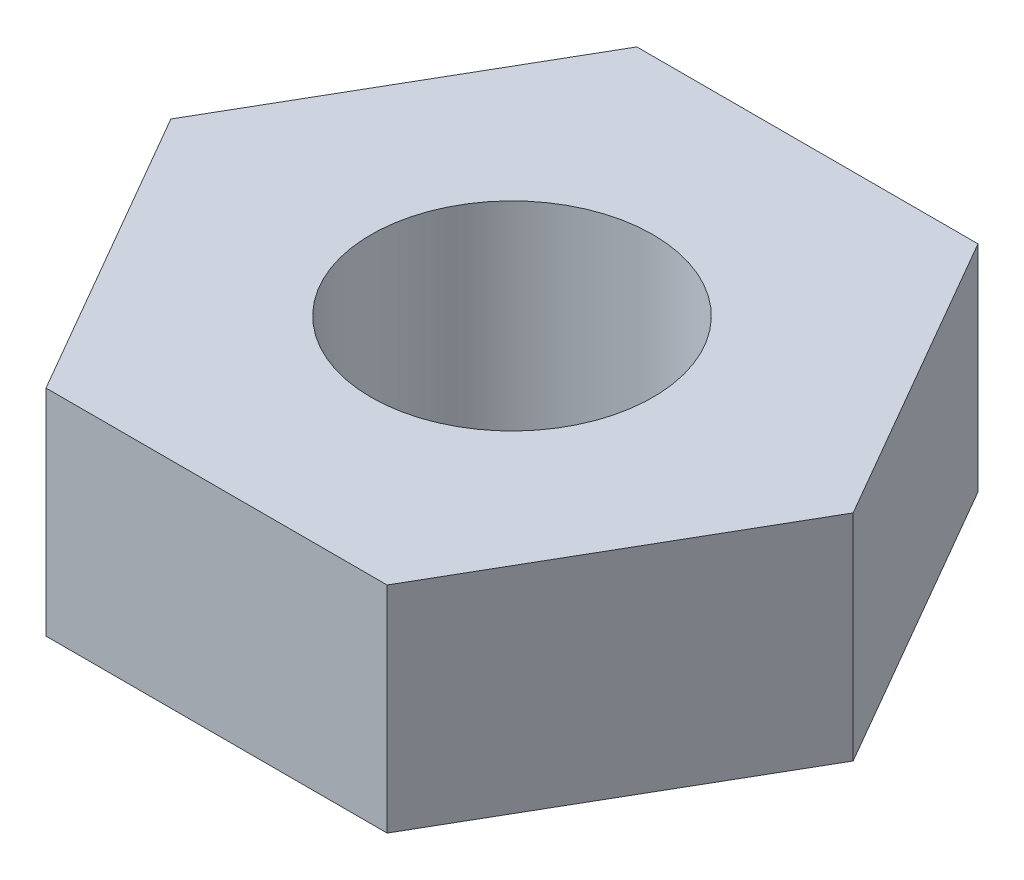
ISO-10303-21;
HEADER;
FILE_DESCRIPTION(('STEP AP214'),'2;1');
FILE_NAME('part.step','',(''),(''),'','','');
FILE_SCHEMA(('AUTOMOTIVE_DESIGN { 1 0 10303 214 1 1 1 1 }'));
ENDSEC;
DATA;
#1=APPLICATION_CONTEXT('core data for automotive mechanical design processes');
#2=APPLICATION_PROTOCOL_DEFINITION('international standard','automotive_design',2000,#1);
#3=PRODUCT_CONTEXT('',#1,'mechanical');
#4=PRODUCT('Part','Part','',(#3));
#5=PRODUCT_RELATED_PRODUCT_CATEGORY('part','',(#4));
#6=PRODUCT_DEFINITION_FORMATION('','',#4);
#7=PRODUCT_DEFINITION_CONTEXT('part definition',#1,'design');
#8=PRODUCT_DEFINITION('design','',#6,#7);
#9=PRODUCT_DEFINITION_SHAPE('','',#8);
#10=(LENGTH_UNIT() NAMED_UNIT(*) SI_UNIT(.MILLI.,.METRE.));
#11=(NAMED_UNIT(*) PLANE_ANGLE_UNIT() SI_UNIT($,.RADIAN.));
#12=(NAMED_UNIT(*) SI_UNIT($,.STERADIAN.) SOLID_ANGLE_UNIT());
#13=UNCERTAINTY_MEASURE_WITH_UNIT(LENGTH_MEASURE(1.E-05),#10,'distance_accuracy_value','');
#14=(GEOMETRIC_REPRESENTATION_CONTEXT(3) GLOBAL_UNCERTAINTY_ASSIGNED_CONTEXT((#13)) GLOBAL_UNIT_ASSIGNED_CONTEXT((#10,
#11,#12)) REPRESENTATION_CONTEXT('',''));
#15=CARTESIAN_POINT('',(0.,0.,0.));
#16=DIRECTION('',(0.,0.,1.));
#17=DIRECTION('',(1.,0.,0.));
#18=AXIS2_PLACEMENT_3D('',#15,#16,#17);
#19=CARTESIAN_POINT('',(5.04098953786192,3.175,0.));
#20=DIRECTION('',(-0.866025403784438,0.,0.5));
#21=DIRECTION('',(0.5,0.,0.866025403784438));
#22=AXIS2_PLACEMENT_3D('',#19,#20,#21);
#23=PLANE('',#22);
#24=DIRECTION('',(-0.5,0.,-0.866025403784438));
#25=VECTOR('',#24,1.);
#26=CARTESIAN_POINT('',(5.04098953786192,0.,0.));
#27=LINE('',#26,#25);
#28=CARTESIAN_POINT('',(5.04098953786192,0.,0.));
#29=VERTEX_POINT('',#28);
#30=CARTESIAN_POINT('',(2.52049476893096,0.,-4.365625));
#31=VERTEX_POINT('',#30);
#32=EDGE_CURVE('E122',#29,#31,#27,.T.);
#33=ORIENTED_EDGE('',*,*,#32,.T.);
#34=DIRECTION('',(0.,-1.,0.));
#35=VECTOR('',#34,1.);
#36=CARTESIAN_POINT('',(2.52049476893096,3.175,-4.365625));
#37=LINE('',#36,#35);
#38=CARTESIAN_POINT('',(2.52049476893096,3.175,-4.365625));
#39=VERTEX_POINT('',#38);
#40=EDGE_CURVE('E11',#39,#31,#37,.T.);
#41=ORIENTED_EDGE('',*,*,#40,.F.);
#42=DIRECTION('',(-0.5,0.,-0.866025403784438));
#43=VECTOR('',#42,1.);
#44=CARTESIAN_POINT('',(5.04098953786192,3.175,0.));
#45=LINE('',#44,#43);
#46=CARTESIAN_POINT('',(5.04098953786192,3.175,0.));
#47=VERTEX_POINT('',#46);
#48=EDGE_CURVE('E133',#47,#39,#45,.T.);
#49=ORIENTED_EDGE('',*,*,#48,.F.);
#50=DIRECTION('',(0.,-1.,0.));
#51=VECTOR('',#50,1.);
#52=CARTESIAN_POINT('',(5.04098953786192,3.175,0.));
#53=LINE('',#52,#51);
#54=EDGE_CURVE('E118',#47,#29,#53,.T.);
#55=ORIENTED_EDGE('',*,*,#54,.T.);
#56=EDGE_LOOP('',(#33,#41,#49,#55));
#57=FACE_BOUND('',#56,.T.);
#58=ADVANCED_FACE('F38',(#57),#23,.F.);
#59=CARTESIAN_POINT('',(2.52049476893096,3.175,-4.365625));
#60=DIRECTION('',(0.,0.,1.));
#61=DIRECTION('',(1.,0.,0.));
#62=AXIS2_PLACEMENT_3D('',#59,#60,#61);
#63=PLANE('',#62);
#64=DIRECTION('',(-1.,0.,0.));
#65=VECTOR('',#64,1.);
#66=CARTESIAN_POINT('',(2.52049476893096,0.,-4.365625));
#67=LINE('',#66,#65);
#68=CARTESIAN_POINT('',(-2.52049476893096,0.,-4.365625));
#69=VERTEX_POINT('',#68);
#70=EDGE_CURVE('E125',#31,#69,#67,.T.);
#71=ORIENTED_EDGE('',*,*,#70,.T.);
#72=DIRECTION('',(0.,-1.,0.));
#73=VECTOR('',#72,1.);
#74=CARTESIAN_POINT('',(-2.52049476893096,3.175,-4.365625));
#75=LINE('',#74,#73);
#76=CARTESIAN_POINT('',(-2.52049476893096,3.175,-4.365625));
#77=VERTEX_POINT('',#76);
#78=EDGE_CURVE('E46',#77,#69,#75,.T.);
#79=ORIENTED_EDGE('',*,*,#78,.F.);
#80=DIRECTION('',(-1.,0.,0.));
#81=VECTOR('',#80,1.);
#82=CARTESIAN_POINT('',(2.52049476893096,3.175,-4.365625));
#83=LINE('',#82,#81);
#84=EDGE_CURVE('E91',#39,#77,#83,.T.);
#85=ORIENTED_EDGE('',*,*,#84,.F.);
#86=ORIENTED_EDGE('',*,*,#40,.T.);
#87=EDGE_LOOP('',(#71,#79,#85,#86));
#88=FACE_BOUND('',#87,.T.);
#89=ADVANCED_FACE('F158',(#88),#63,.F.);
#90=CARTESIAN_POINT('',(-2.52049476893096,3.175,-4.365625));
#91=DIRECTION('',(0.866025403784439,0.,0.5));
#92=DIRECTION('',(0.5,0.,-0.866025403784439));
#93=AXIS2_PLACEMENT_3D('',#90,#91,#92);
#94=PLANE('',#93);
#95=DIRECTION('',(-0.5,0.,0.866025403784438));
#96=VECTOR('',#95,1.);
#97=CARTESIAN_POINT('',(-2.52049476893096,0.,-4.365625));
#98=LINE('',#97,#96);
#99=CARTESIAN_POINT('',(-5.04098953786192,0.,0.));
#100=VERTEX_POINT('',#99);
#101=EDGE_CURVE('E128',#69,#100,#98,.T.);
#102=ORIENTED_EDGE('',*,*,#101,.T.);
#103=DIRECTION('',(0.,-1.,0.));
#104=VECTOR('',#103,1.);
#105=CARTESIAN_POINT('',(-5.04098953786192,3.175,0.));
#106=LINE('',#105,#104);
#107=CARTESIAN_POINT('',(-5.04098953786192,3.175,0.));
#108=VERTEX_POINT('',#107);
#109=EDGE_CURVE('E113',#108,#100,#106,.T.);
#110=ORIENTED_EDGE('',*,*,#109,.F.);
#111=DIRECTION('',(-0.5,0.,0.866025403784438));
#112=VECTOR('',#111,1.);
#113=CARTESIAN_POINT('',(-2.52049476893096,3.175,-4.365625));
#114=LINE('',#113,#112);
#115=EDGE_CURVE('E104',#77,#108,#114,.T.);
#116=ORIENTED_EDGE('',*,*,#115,.F.);
#117=ORIENTED_EDGE('',*,*,#78,.T.);
#118=EDGE_LOOP('',(#102,#110,#116,#117));
#119=FACE_BOUND('',#118,.T.);
#120=ADVANCED_FACE('F139',(#119),#94,.F.);
#121=CARTESIAN_POINT('',(-5.04098953786192,3.175,0.));
#122=DIRECTION('',(0.866025403784439,0.,-0.5));
#123=DIRECTION('',(-0.5,0.,-0.866025403784439));
#124=AXIS2_PLACEMENT_3D('',#121,#122,#123);
#125=PLANE('',#124);
#126=DIRECTION('',(0.5,0.,0.866025403784439));
#127=VECTOR('',#126,1.);
#128=CARTESIAN_POINT('',(-5.04098953786192,0.,0.));
#129=LINE('',#128,#127);
#130=CARTESIAN_POINT('',(-2.52049476893096,0.,4.365625));
#131=VERTEX_POINT('',#130);
#132=EDGE_CURVE('E112',#100,#131,#129,.T.);
#133=ORIENTED_EDGE('',*,*,#132,.T.);
#134=DIRECTION('',(0.,-1.,0.));
#135=VECTOR('',#134,1.);
#136=CARTESIAN_POINT('',(-2.52049476893096,3.175,4.365625));
#137=LINE('',#136,#135);
#138=CARTESIAN_POINT('',(-2.52049476893096,3.175,4.365625));
#139=VERTEX_POINT('',#138);
#140=EDGE_CURVE('E109',#139,#131,#137,.T.);
#141=ORIENTED_EDGE('',*,*,#140,.F.);
#142=DIRECTION('',(0.5,0.,0.866025403784439));
#143=VECTOR('',#142,1.);
#144=CARTESIAN_POINT('',(-5.04098953786192,3.175,0.));
#145=LINE('',#144,#143);
#146=EDGE_CURVE('E98',#108,#139,#145,.T.);
#147=ORIENTED_EDGE('',*,*,#146,.F.);
#148=ORIENTED_EDGE('',*,*,#109,.T.);
#149=EDGE_LOOP('',(#133,#141,#147,#148));
#150=FACE_BOUND('',#149,.T.);
#151=ADVANCED_FACE('F110',(#150),#125,.F.);
#152=CARTESIAN_POINT('',(-2.52049476893096,3.175,4.365625));
#153=DIRECTION('',(0.,0.,-1.));
#154=DIRECTION('',(-1.,0.,0.));
#155=AXIS2_PLACEMENT_3D('',#152,#153,#154);
#156=PLANE('',#155);
#157=DIRECTION('',(1.,0.,0.));
#158=VECTOR('',#157,1.);
#159=CARTESIAN_POINT('',(-2.52049476893096,0.,4.365625));
#160=LINE('',#159,#158);
#161=CARTESIAN_POINT('',(2.52049476893096,0.,4.365625));
#162=VERTEX_POINT('',#161);
#163=EDGE_CURVE('E77',#131,#162,#160,.T.);
#164=ORIENTED_EDGE('',*,*,#163,.T.);
#165=DIRECTION('',(0.,-1.,0.));
#166=VECTOR('',#165,1.);
#167=CARTESIAN_POINT('',(2.52049476893096,3.175,4.365625));
#168=LINE('',#167,#166);
#169=CARTESIAN_POINT('',(2.52049476893096,3.175,4.365625));
#170=VERTEX_POINT('',#169);
#171=EDGE_CURVE('E114',#170,#162,#168,.T.);
#172=ORIENTED_EDGE('',*,*,#171,.F.);
#173=DIRECTION('',(1.,0.,0.));
#174=VECTOR('',#173,1.);
#175=CARTESIAN_POINT('',(-2.52049476893096,3.175,4.365625));
#176=LINE('',#175,#174);
#177=EDGE_CURVE('E102',#139,#170,#176,.T.);
#178=ORIENTED_EDGE('',*,*,#177,.F.);
#179=ORIENTED_EDGE('',*,*,#140,.T.);
#180=EDGE_LOOP('',(#164,#172,#178,#179));
#181=FACE_BOUND('',#180,.T.);
#182=ADVANCED_FACE('F116',(#181),#156,.F.);
#183=CARTESIAN_POINT('',(2.52049476893096,3.175,4.365625));
#184=DIRECTION('',(-0.866025403784438,0.,-0.5));
#185=DIRECTION('',(-0.5,0.,0.866025403784439));
#186=AXIS2_PLACEMENT_3D('',#183,#184,#185);
#187=PLANE('',#186);
#188=DIRECTION('',(0.5,0.,-0.866025403784438));
#189=VECTOR('',#188,1.);
#190=CARTESIAN_POINT('',(2.52049476893096,0.,4.365625));
#191=LINE('',#190,#189);
#192=EDGE_CURVE('E83',#162,#29,#191,.T.);
#193=ORIENTED_EDGE('',*,*,#192,.T.);
#194=ORIENTED_EDGE('',*,*,#54,.F.);
#195=DIRECTION('',(0.5,0.,-0.866025403784438));
#196=VECTOR('',#195,1.);
#197=CARTESIAN_POINT('',(2.52049476893096,3.175,4.365625));
#198=LINE('',#197,#196);
#199=EDGE_CURVE('E54',#170,#47,#198,.T.);
#200=ORIENTED_EDGE('',*,*,#199,.F.);
#201=ORIENTED_EDGE('',*,*,#171,.T.);
#202=EDGE_LOOP('',(#193,#194,#200,#201));
#203=FACE_BOUND('',#202,.T.);
#204=ADVANCED_FACE('F146',(#203),#187,.F.);
#205=CARTESIAN_POINT('',(0.,3.175,0.));
#206=DIRECTION('',(0.,1.,0.));
#207=DIRECTION('',(0.,0.,1.));
#208=AXIS2_PLACEMENT_3D('',#205,#206,#207);
#209=PLANE('',#208);
#210=CARTESIAN_POINT('',(0.,3.175,0.));
#211=DIRECTION('',(0.,1.,0.));
#212=DIRECTION('',(0.,0.,1.));
#213=AXIS2_PLACEMENT_3D('',#210,#211,#212);
#214=CIRCLE('',#213,2.0828);
#215=CARTESIAN_POINT('',(0.,3.175,2.0828));
#216=VERTEX_POINT('',#215);
#217=EDGE_CURVE('E218',#216,#216,#214,.T.);
#218=ORIENTED_EDGE('',*,*,#217,.F.);
#219=EDGE_LOOP('',(#218));
#220=FACE_BOUND('',#219,.T.);
#221=ORIENTED_EDGE('',*,*,#48,.T.);
#222=ORIENTED_EDGE('',*,*,#84,.T.);
#223=ORIENTED_EDGE('',*,*,#115,.T.);
#224=ORIENTED_EDGE('',*,*,#146,.T.);
#225=ORIENTED_EDGE('',*,*,#177,.T.);
#226=ORIENTED_EDGE('',*,*,#199,.T.);
#227=EDGE_LOOP('',(#221,#222,#223,#224,#225,#226));
#228=FACE_BOUND('',#227,.T.);
#229=ADVANCED_FACE('F100',(#220,#228),#209,.T.);
#230=CARTESIAN_POINT('',(0.,0.,0.));
#231=DIRECTION('',(0.,1.,0.));
#232=DIRECTION('',(0.,0.,1.));
#233=AXIS2_PLACEMENT_3D('',#230,#231,#232);
#234=PLANE('',#233);
#235=CARTESIAN_POINT('',(0.,0.,0.));
#236=DIRECTION('',(0.,1.,0.));
#237=DIRECTION('',(0.,0.,1.));
#238=AXIS2_PLACEMENT_3D('',#235,#236,#237);
#239=CIRCLE('',#238,2.0828);
#240=CARTESIAN_POINT('',(0.,0.,2.0828));
#241=VERTEX_POINT('',#240);
#242=EDGE_CURVE('E126',#241,#241,#239,.T.);
#243=ORIENTED_EDGE('',*,*,#242,.T.);
#244=EDGE_LOOP('',(#243));
#245=FACE_BOUND('',#244,.T.);
#246=ORIENTED_EDGE('',*,*,#32,.F.);
#247=ORIENTED_EDGE('',*,*,#192,.F.);
#248=ORIENTED_EDGE('',*,*,#163,.F.);
#249=ORIENTED_EDGE('',*,*,#132,.F.);
#250=ORIENTED_EDGE('',*,*,#101,.F.);
#251=ORIENTED_EDGE('',*,*,#70,.F.);
#252=EDGE_LOOP('',(#246,#247,#248,#249,#250,#251));
#253=FACE_BOUND('',#252,.T.);
#254=ADVANCED_FACE('F142',(#245,#253),#234,.F.);
#255=CARTESIAN_POINT('',(0.,0.,0.));
#256=DIRECTION('',(0.,1.,0.));
#257=DIRECTION('',(0.,0.,1.));
#258=AXIS2_PLACEMENT_3D('',#255,#256,#257);
#259=CYLINDRICAL_SURFACE('',#258,2.0828);
#260=ORIENTED_EDGE('',*,*,#242,.F.);
#261=EDGE_LOOP('',(#260));
#262=FACE_BOUND('',#261,.T.);
#263=ORIENTED_EDGE('',*,*,#217,.T.);
#264=EDGE_LOOP('',(#263));
#265=FACE_BOUND('',#264,.T.);
#266=ADVANCED_FACE('F197',(#262,#265),#259,.F.);
#267=CLOSED_SHELL('',(#58,#89,#120,#151,#182,#204,#229,#254,#266));
#268=MANIFOLD_SOLID_BREP('B2',#267);
#269=ADVANCED_BREP_SHAPE_REPRESENTATION('',(#18,#268),#14);
#270=SHAPE_DEFINITION_REPRESENTATION(#9,#269);
ENDSEC;
END-ISO-10303-21;
